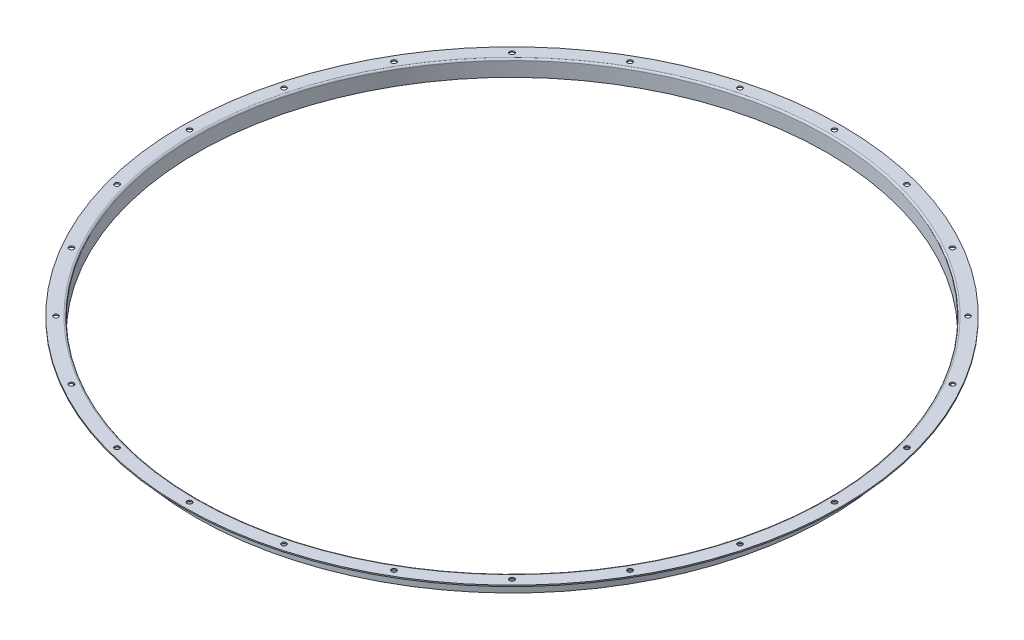
ISO-10303-21;
HEADER;
FILE_DESCRIPTION(('STEP AP214'),'2;1');
FILE_NAME('part.step','',(''),(''),'','','');
FILE_SCHEMA(('AUTOMOTIVE_DESIGN { 1 0 10303 214 1 1 1 1 }'));
ENDSEC;
DATA;
#1=APPLICATION_CONTEXT('core data for automotive mechanical design processes');
#2=APPLICATION_PROTOCOL_DEFINITION('international standard','automotive_design',2000,#1);
#3=PRODUCT_CONTEXT('',#1,'mechanical');
#4=PRODUCT('Part','Part','',(#3));
#5=PRODUCT_RELATED_PRODUCT_CATEGORY('part','',(#4));
#6=PRODUCT_DEFINITION_FORMATION('','',#4);
#7=PRODUCT_DEFINITION_CONTEXT('part definition',#1,'design');
#8=PRODUCT_DEFINITION('design','',#6,#7);
#9=PRODUCT_DEFINITION_SHAPE('','',#8);
#10=(LENGTH_UNIT() NAMED_UNIT(*) SI_UNIT(.MILLI.,.METRE.));
#11=(NAMED_UNIT(*) PLANE_ANGLE_UNIT() SI_UNIT($,.RADIAN.));
#12=(NAMED_UNIT(*) SI_UNIT($,.STERADIAN.) SOLID_ANGLE_UNIT());
#13=UNCERTAINTY_MEASURE_WITH_UNIT(LENGTH_MEASURE(1.E-05),#10,'distance_accuracy_value','');
#14=(GEOMETRIC_REPRESENTATION_CONTEXT(3) GLOBAL_UNCERTAINTY_ASSIGNED_CONTEXT((#13)) GLOBAL_UNIT_ASSIGNED_CONTEXT((#10,
#11,#12)) REPRESENTATION_CONTEXT('',''));
#15=CARTESIAN_POINT('',(0.,0.,0.));
#16=DIRECTION('',(0.,0.,1.));
#17=DIRECTION('',(1.,0.,0.));
#18=AXIS2_PLACEMENT_3D('',#15,#16,#17);
#19=CARTESIAN_POINT('',(0.,-2.5,0.));
#20=DIRECTION('',(0.,1.,0.));
#21=DIRECTION('',(0.,0.,1.));
#22=AXIS2_PLACEMENT_3D('',#19,#20,#21);
#23=PLANE('',#22);
#24=CARTESIAN_POINT('',(471.993776442016,-2.5,-471.993776442047));
#25=DIRECTION('',(0.,1.,0.));
#26=DIRECTION('',(0.,0.,1.));
#27=AXIS2_PLACEMENT_3D('',#24,#25,#26);
#28=CIRCLE('',#27,5.00000000007998);
#29=CARTESIAN_POINT('',(471.993776442016,-2.5,-466.993776441967));
#30=VERTEX_POINT('',#29);
#31=EDGE_CURVE('E139',#30,#30,#28,.T.);
#32=ORIENTED_EDGE('',*,*,#31,.T.);
#33=EDGE_LOOP('',(#32));
#34=FACE_BOUND('',#33,.T.);
#35=CARTESIAN_POINT('',(-1.5496433923496E-11,-2.5,-667.5));
#36=DIRECTION('',(0.,1.,0.));
#37=DIRECTION('',(0.,0.,1.));
#38=AXIS2_PLACEMENT_3D('',#35,#36,#37);
#39=CIRCLE('',#38,5.00000000007998);
#40=CARTESIAN_POINT('',(-1.5496433923496E-11,-2.5,-662.49999999992));
#41=VERTEX_POINT('',#40);
#42=EDGE_CURVE('E349',#41,#41,#39,.T.);
#43=ORIENTED_EDGE('',*,*,#42,.T.);
#44=EDGE_LOOP('',(#43));
#45=FACE_BOUND('',#44,.T.);
#46=CARTESIAN_POINT('',(333.749999999989,-2.5,-578.071957026132));
#47=DIRECTION('',(0.,1.,0.));
#48=DIRECTION('',(0.,0.,1.));
#49=AXIS2_PLACEMENT_3D('',#46,#47,#48);
#50=CIRCLE('',#49,5.00000000007999);
#51=CARTESIAN_POINT('',(333.749999999989,-2.5,-573.071957026052));
#52=VERTEX_POINT('',#51);
#53=EDGE_CURVE('E347',#52,#52,#50,.T.);
#54=ORIENTED_EDGE('',*,*,#53,.T.);
#55=EDGE_LOOP('',(#54));
#56=FACE_BOUND('',#55,.T.);
#57=CARTESIAN_POINT('',(172.761712605918,-2.5,-644.755489047963));
#58=DIRECTION('',(0.,1.,0.));
#59=DIRECTION('',(0.,0.,1.));
#60=AXIS2_PLACEMENT_3D('',#57,#58,#59);
#61=CIRCLE('',#60,5.00000000007999);
#62=CARTESIAN_POINT('',(172.761712605918,-2.5,-639.755489047883));
#63=VERTEX_POINT('',#62);
#64=EDGE_CURVE('E344',#63,#63,#61,.T.);
#65=ORIENTED_EDGE('',*,*,#64,.T.);
#66=EDGE_LOOP('',(#65));
#67=FACE_BOUND('',#66,.T.);
#68=CARTESIAN_POINT('',(578.071957026116,-2.5,-333.750000000033));
#69=DIRECTION('',(0.,1.,0.));
#70=DIRECTION('',(0.,0.,1.));
#71=AXIS2_PLACEMENT_3D('',#68,#69,#70);
#72=CIRCLE('',#71,5.00000000007992);
#73=CARTESIAN_POINT('',(578.071957026116,-2.5,-328.749999999953));
#74=VERTEX_POINT('',#73);
#75=EDGE_CURVE('E341',#74,#74,#72,.T.);
#76=ORIENTED_EDGE('',*,*,#75,.T.);
#77=EDGE_LOOP('',(#76));
#78=FACE_BOUND('',#77,.T.);
#79=CARTESIAN_POINT('',(644.755489047966,-2.5,-172.761712605969));
#80=DIRECTION('',(0.,1.,0.));
#81=DIRECTION('',(0.,0.,1.));
#82=AXIS2_PLACEMENT_3D('',#79,#80,#81);
#83=CIRCLE('',#82,5.00000000007992);
#84=CARTESIAN_POINT('',(644.755489047966,-2.5,-167.761712605889));
#85=VERTEX_POINT('',#84);
#86=EDGE_CURVE('E338',#85,#85,#83,.T.);
#87=ORIENTED_EDGE('',*,*,#86,.T.);
#88=EDGE_LOOP('',(#87));
#89=FACE_BOUND('',#88,.T.);
#90=CARTESIAN_POINT('',(667.500000000022,-2.5,-3.78612369157463E-11));
#91=DIRECTION('',(0.,1.,0.));
#92=DIRECTION('',(0.,0.,1.));
#93=AXIS2_PLACEMENT_3D('',#90,#91,#92);
#94=CIRCLE('',#93,5.00000000007992);
#95=CARTESIAN_POINT('',(667.500000000022,-2.5,5.00000000004206));
#96=VERTEX_POINT('',#95);
#97=EDGE_CURVE('E335',#96,#96,#94,.T.);
#98=ORIENTED_EDGE('',*,*,#97,.T.);
#99=EDGE_LOOP('',(#98));
#100=FACE_BOUND('',#99,.T.);
#101=CARTESIAN_POINT('',(644.755489047985,-2.5,172.761712605896));
#102=DIRECTION('',(0.,1.,0.));
#103=DIRECTION('',(0.,0.,1.));
#104=AXIS2_PLACEMENT_3D('',#101,#102,#103);
#105=CIRCLE('',#104,5.00000000007992);
#106=CARTESIAN_POINT('',(644.755489047985,-2.5,177.761712605976));
#107=VERTEX_POINT('',#106);
#108=EDGE_CURVE('E332',#107,#107,#105,.T.);
#109=ORIENTED_EDGE('',*,*,#108,.T.);
#110=EDGE_LOOP('',(#109));
#111=FACE_BOUND('',#110,.T.);
#112=CARTESIAN_POINT('',(578.071957026154,-2.5,333.749999999967));
#113=DIRECTION('',(0.,1.,0.));
#114=DIRECTION('',(0.,0.,1.));
#115=AXIS2_PLACEMENT_3D('',#112,#113,#114);
#116=CIRCLE('',#115,5.00000000007992);
#117=CARTESIAN_POINT('',(578.071957026154,-2.5,338.750000000047));
#118=VERTEX_POINT('',#117);
#119=EDGE_CURVE('E329',#118,#118,#116,.T.);
#120=ORIENTED_EDGE('',*,*,#119,.T.);
#121=EDGE_LOOP('',(#120));
#122=FACE_BOUND('',#121,.T.);
#123=CARTESIAN_POINT('',(471.99377644207,-2.5,471.993776441994));
#124=DIRECTION('',(0.,1.,0.));
#125=DIRECTION('',(0.,0.,1.));
#126=AXIS2_PLACEMENT_3D('',#123,#124,#125);
#127=CIRCLE('',#126,5.00000000007998);
#128=CARTESIAN_POINT('',(471.99377644207,-2.5,476.993776442074));
#129=VERTEX_POINT('',#128);
#130=EDGE_CURVE('E326',#129,#129,#127,.T.);
#131=ORIENTED_EDGE('',*,*,#130,.T.);
#132=EDGE_LOOP('',(#131));
#133=FACE_BOUND('',#132,.T.);
#134=CARTESIAN_POINT('',(333.750000000055,-2.5,578.071957026094));
#135=DIRECTION('',(0.,1.,0.));
#136=DIRECTION('',(0.,0.,1.));
#137=AXIS2_PLACEMENT_3D('',#134,#135,#136);
#138=CIRCLE('',#137,5.00000000007999);
#139=CARTESIAN_POINT('',(333.750000000055,-2.5,583.071957026174));
#140=VERTEX_POINT('',#139);
#141=EDGE_CURVE('E323',#140,#140,#138,.T.);
#142=ORIENTED_EDGE('',*,*,#141,.T.);
#143=EDGE_LOOP('',(#142));
#144=FACE_BOUND('',#143,.T.);
#145=CARTESIAN_POINT('',(172.761712605992,-2.5,644.755489047943));
#146=DIRECTION('',(0.,1.,0.));
#147=DIRECTION('',(0.,0.,1.));
#148=AXIS2_PLACEMENT_3D('',#145,#146,#147);
#149=CIRCLE('',#148,5.00000000007999);
#150=CARTESIAN_POINT('',(172.761712605992,-2.5,649.755489048023));
#151=VERTEX_POINT('',#150);
#152=EDGE_CURVE('E320',#151,#151,#149,.T.);
#153=ORIENTED_EDGE('',*,*,#152,.T.);
#154=EDGE_LOOP('',(#153));
#155=FACE_BOUND('',#154,.T.);
#156=CARTESIAN_POINT('',(6.02260399079966E-11,-2.5,667.5));
#157=DIRECTION('',(0.,1.,0.));
#158=DIRECTION('',(0.,0.,1.));
#159=AXIS2_PLACEMENT_3D('',#156,#157,#158);
#160=CIRCLE('',#159,5.00000000007998);
#161=CARTESIAN_POINT('',(6.02260399079966E-11,-2.5,672.50000000008));
#162=VERTEX_POINT('',#161);
#163=EDGE_CURVE('E317',#162,#162,#160,.T.);
#164=ORIENTED_EDGE('',*,*,#163,.T.);
#165=EDGE_LOOP('',(#164));
#166=FACE_BOUND('',#165,.T.);
#167=CARTESIAN_POINT('',(-172.761712605873,-2.5,644.755489047963));
#168=DIRECTION('',(0.,1.,0.));
#169=DIRECTION('',(0.,0.,1.));
#170=AXIS2_PLACEMENT_3D('',#167,#168,#169);
#171=CIRCLE('',#170,5.00000000007999);
#172=CARTESIAN_POINT('',(-172.761712605873,-2.5,649.755489048043));
#173=VERTEX_POINT('',#172);
#174=EDGE_CURVE('E314',#173,#173,#171,.T.);
#175=ORIENTED_EDGE('',*,*,#174,.T.);
#176=EDGE_LOOP('',(#175));
#177=FACE_BOUND('',#176,.T.);
#178=CARTESIAN_POINT('',(-333.749999999945,-2.5,578.071957026132));
#179=DIRECTION('',(0.,1.,0.));
#180=DIRECTION('',(0.,0.,1.));
#181=AXIS2_PLACEMENT_3D('',#178,#179,#180);
#182=CIRCLE('',#181,5.00000000007999);
#183=CARTESIAN_POINT('',(-333.749999999945,-2.5,583.071957026212));
#184=VERTEX_POINT('',#183);
#185=EDGE_CURVE('E311',#184,#184,#182,.T.);
#186=ORIENTED_EDGE('',*,*,#185,.T.);
#187=EDGE_LOOP('',(#186));
#188=FACE_BOUND('',#187,.T.);
#189=CARTESIAN_POINT('',(-471.993776441971,-2.5,471.993776442047));
#190=DIRECTION('',(0.,1.,0.));
#191=DIRECTION('',(0.,0.,1.));
#192=AXIS2_PLACEMENT_3D('',#189,#190,#191);
#193=CIRCLE('',#192,5.00000000007998);
#194=CARTESIAN_POINT('',(-471.993776441971,-2.5,476.993776442127));
#195=VERTEX_POINT('',#194);
#196=EDGE_CURVE('E308',#195,#195,#193,.T.);
#197=ORIENTED_EDGE('',*,*,#196,.T.);
#198=EDGE_LOOP('',(#197));
#199=FACE_BOUND('',#198,.T.);
#200=CARTESIAN_POINT('',(-172.761712605947,-2.5,-644.755489047943));
#201=DIRECTION('',(0.,1.,0.));
#202=DIRECTION('',(0.,0.,1.));
#203=AXIS2_PLACEMENT_3D('',#200,#201,#202);
#204=CIRCLE('',#203,5.00000000007999);
#205=CARTESIAN_POINT('',(-172.761712605947,-2.5,-639.755489047863));
#206=VERTEX_POINT('',#205);
#207=EDGE_CURVE('E299',#206,#206,#204,.T.);
#208=ORIENTED_EDGE('',*,*,#207,.T.);
#209=EDGE_LOOP('',(#208));
#210=FACE_BOUND('',#209,.T.);
#211=CARTESIAN_POINT('',(-578.07195702611,-2.5,-333.749999999967));
#212=DIRECTION('',(0.,1.,0.));
#213=DIRECTION('',(0.,0.,1.));
#214=AXIS2_PLACEMENT_3D('',#211,#212,#213);
#215=CIRCLE('',#214,5.00000000008166);
#216=CARTESIAN_POINT('',(-578.07195702611,-2.5,-328.749999999885));
#217=VERTEX_POINT('',#216);
#218=EDGE_CURVE('E295',#217,#217,#215,.T.);
#219=ORIENTED_EDGE('',*,*,#218,.T.);
#220=EDGE_LOOP('',(#219));
#221=FACE_BOUND('',#220,.T.);
#222=CARTESIAN_POINT('',(-471.993776442025,-2.5,-471.993776441994));
#223=DIRECTION('',(0.,1.,0.));
#224=DIRECTION('',(0.,0.,1.));
#225=AXIS2_PLACEMENT_3D('',#222,#223,#224);
#226=CIRCLE('',#225,5.00000000008247);
#227=CARTESIAN_POINT('',(-471.993776442025,-2.5,-466.993776441911));
#228=VERTEX_POINT('',#227);
#229=EDGE_CURVE('E293',#228,#228,#226,.T.);
#230=ORIENTED_EDGE('',*,*,#229,.T.);
#231=EDGE_LOOP('',(#230));
#232=FACE_BOUND('',#231,.T.);
#233=CARTESIAN_POINT('',(-333.750000000011,-2.5,-578.071957026094));
#234=DIRECTION('',(0.,1.,0.));
#235=DIRECTION('',(0.,0.,1.));
#236=AXIS2_PLACEMENT_3D('',#233,#234,#235);
#237=CIRCLE('',#236,5.00000000008293);
#238=CARTESIAN_POINT('',(-333.750000000011,-2.5,-573.071957026011));
#239=VERTEX_POINT('',#238);
#240=EDGE_CURVE('E296',#239,#239,#237,.T.);
#241=ORIENTED_EDGE('',*,*,#240,.T.);
#242=EDGE_LOOP('',(#241));
#243=FACE_BOUND('',#242,.T.);
#244=CARTESIAN_POINT('',(-644.755489047941,-2.5,-172.761712605896));
#245=DIRECTION('',(0.,1.,0.));
#246=DIRECTION('',(0.,0.,1.));
#247=AXIS2_PLACEMENT_3D('',#244,#245,#246);
#248=CIRCLE('',#247,5.00000000007981);
#249=CARTESIAN_POINT('',(-644.755489047941,-2.5,-167.761712605816));
#250=VERTEX_POINT('',#249);
#251=EDGE_CURVE('E302',#250,#250,#248,.T.);
#252=ORIENTED_EDGE('',*,*,#251,.T.);
#253=EDGE_LOOP('',(#252));
#254=FACE_BOUND('',#253,.T.);
#255=CARTESIAN_POINT('',(-667.499999999978,-2.5,3.79429820895893E-11));
#256=DIRECTION('',(0.,1.,0.));
#257=DIRECTION('',(0.,0.,1.));
#258=AXIS2_PLACEMENT_3D('',#255,#256,#257);
#259=CIRCLE('',#258,5.00000000007992);
#260=CARTESIAN_POINT('',(-667.499999999978,-2.5,5.00000000011787));
#261=VERTEX_POINT('',#260);
#262=EDGE_CURVE('E396',#261,#261,#259,.T.);
#263=ORIENTED_EDGE('',*,*,#262,.T.);
#264=EDGE_LOOP('',(#263));
#265=FACE_BOUND('',#264,.T.);
#266=CARTESIAN_POINT('',(-644.755489047921,-2.5,172.76171260597));
#267=DIRECTION('',(0.,1.,0.));
#268=DIRECTION('',(0.,0.,1.));
#269=AXIS2_PLACEMENT_3D('',#266,#267,#268);
#270=CIRCLE('',#269,5.00000000007992);
#271=CARTESIAN_POINT('',(-644.755489047921,-2.5,177.76171260605));
#272=VERTEX_POINT('',#271);
#273=EDGE_CURVE('E400',#272,#272,#270,.T.);
#274=ORIENTED_EDGE('',*,*,#273,.T.);
#275=EDGE_LOOP('',(#274));
#276=FACE_BOUND('',#275,.T.);
#277=CARTESIAN_POINT('',(-578.071957026071,-2.5,333.750000000033));
#278=DIRECTION('',(0.,1.,0.));
#279=DIRECTION('',(0.,0.,1.));
#280=AXIS2_PLACEMENT_3D('',#277,#278,#279);
#281=CIRCLE('',#280,5.00000000007992);
#282=CARTESIAN_POINT('',(-578.071957026071,-2.5,338.750000000113));
#283=VERTEX_POINT('',#282);
#284=EDGE_CURVE('E404',#283,#283,#281,.T.);
#285=ORIENTED_EDGE('',*,*,#284,.T.);
#286=EDGE_LOOP('',(#285));
#287=FACE_BOUND('',#286,.T.);
#288=CARTESIAN_POINT('',(0.,-2.5,0.));
#289=DIRECTION('',(0.,1.,0.));
#290=DIRECTION('',(0.,0.,1.));
#291=AXIS2_PLACEMENT_3D('',#288,#289,#290);
#292=CIRCLE('',#291,682.5);
#293=CARTESIAN_POINT('',(0.,-2.5,682.5));
#294=VERTEX_POINT('',#293);
#295=EDGE_CURVE('E96',#294,#294,#292,.T.);
#296=ORIENTED_EDGE('',*,*,#295,.F.);
#297=EDGE_LOOP('',(#296));
#298=FACE_BOUND('',#297,.T.);
#299=CARTESIAN_POINT('',(0.,-2.5,0.));
#300=DIRECTION('',(0.,1.,0.));
#301=DIRECTION('',(0.,0.,1.));
#302=AXIS2_PLACEMENT_3D('',#299,#300,#301);
#303=CIRCLE('',#302,656.);
#304=CARTESIAN_POINT('',(0.,-2.5,656.));
#305=VERTEX_POINT('',#304);
#306=EDGE_CURVE('E12',#305,#305,#303,.F.);
#307=ORIENTED_EDGE('',*,*,#306,.F.);
#308=EDGE_LOOP('',(#307));
#309=FACE_BOUND('',#308,.T.);
#310=ADVANCED_FACE('F88',(#34,#45,#56,#67,#78,#89,#100,#111,#122,#133,#144,#155,#166,#177,#188,
#199,#210,#221,#232,#243,#254,#265,#276,#287,#298,#309),#23,.F.);
#311=CARTESIAN_POINT('',(0.,0.,0.));
#312=DIRECTION('',(0.,1.,0.));
#313=DIRECTION('',(0.,0.,1.));
#314=AXIS2_PLACEMENT_3D('',#311,#312,#313);
#315=PLANE('',#314);
#316=CARTESIAN_POINT('',(471.993776442016,0.,-471.993776442047));
#317=DIRECTION('',(0.,1.,0.));
#318=DIRECTION('',(0.,0.,1.));
#319=AXIS2_PLACEMENT_3D('',#316,#317,#318);
#320=CIRCLE('',#319,5.00000000007998);
#321=CARTESIAN_POINT('',(471.993776442016,0.,-466.993776441967));
#322=VERTEX_POINT('',#321);
#323=EDGE_CURVE('E452',#322,#322,#320,.T.);
#324=ORIENTED_EDGE('',*,*,#323,.F.);
#325=EDGE_LOOP('',(#324));
#326=FACE_BOUND('',#325,.T.);
#327=CARTESIAN_POINT('',(-1.5496433923496E-11,0.,-667.5));
#328=DIRECTION('',(0.,1.,0.));
#329=DIRECTION('',(0.,0.,1.));
#330=AXIS2_PLACEMENT_3D('',#327,#328,#329);
#331=CIRCLE('',#330,5.00000000007998);
#332=CARTESIAN_POINT('',(-1.5496433923496E-11,0.,-662.49999999992));
#333=VERTEX_POINT('',#332);
#334=EDGE_CURVE('E456',#333,#333,#331,.T.);
#335=ORIENTED_EDGE('',*,*,#334,.F.);
#336=EDGE_LOOP('',(#335));
#337=FACE_BOUND('',#336,.T.);
#338=CARTESIAN_POINT('',(333.749999999989,0.,-578.071957026132));
#339=DIRECTION('',(0.,1.,0.));
#340=DIRECTION('',(0.,0.,1.));
#341=AXIS2_PLACEMENT_3D('',#338,#339,#340);
#342=CIRCLE('',#341,5.00000000007999);
#343=CARTESIAN_POINT('',(333.749999999989,0.,-573.071957026052));
#344=VERTEX_POINT('',#343);
#345=EDGE_CURVE('E453',#344,#344,#342,.T.);
#346=ORIENTED_EDGE('',*,*,#345,.F.);
#347=EDGE_LOOP('',(#346));
#348=FACE_BOUND('',#347,.T.);
#349=CARTESIAN_POINT('',(172.761712605918,0.,-644.755489047963));
#350=DIRECTION('',(0.,1.,0.));
#351=DIRECTION('',(0.,0.,1.));
#352=AXIS2_PLACEMENT_3D('',#349,#350,#351);
#353=CIRCLE('',#352,5.00000000007999);
#354=CARTESIAN_POINT('',(172.761712605918,0.,-639.755489047883));
#355=VERTEX_POINT('',#354);
#356=EDGE_CURVE('E411',#355,#355,#353,.T.);
#357=ORIENTED_EDGE('',*,*,#356,.F.);
#358=EDGE_LOOP('',(#357));
#359=FACE_BOUND('',#358,.T.);
#360=CARTESIAN_POINT('',(578.071957026116,0.,-333.750000000033));
#361=DIRECTION('',(0.,1.,0.));
#362=DIRECTION('',(0.,0.,1.));
#363=AXIS2_PLACEMENT_3D('',#360,#361,#362);
#364=CIRCLE('',#363,5.00000000007992);
#365=CARTESIAN_POINT('',(578.071957026116,0.,-328.749999999953));
#366=VERTEX_POINT('',#365);
#367=EDGE_CURVE('E449',#366,#366,#364,.T.);
#368=ORIENTED_EDGE('',*,*,#367,.F.);
#369=EDGE_LOOP('',(#368));
#370=FACE_BOUND('',#369,.T.);
#371=CARTESIAN_POINT('',(644.755489047966,0.,-172.761712605969));
#372=DIRECTION('',(0.,1.,0.));
#373=DIRECTION('',(0.,0.,1.));
#374=AXIS2_PLACEMENT_3D('',#371,#372,#373);
#375=CIRCLE('',#374,5.00000000007992);
#376=CARTESIAN_POINT('',(644.755489047966,0.,-167.761712605889));
#377=VERTEX_POINT('',#376);
#378=EDGE_CURVE('E446',#377,#377,#375,.T.);
#379=ORIENTED_EDGE('',*,*,#378,.F.);
#380=EDGE_LOOP('',(#379));
#381=FACE_BOUND('',#380,.T.);
#382=CARTESIAN_POINT('',(667.500000000022,0.,-3.78612369157463E-11));
#383=DIRECTION('',(0.,1.,0.));
#384=DIRECTION('',(0.,0.,1.));
#385=AXIS2_PLACEMENT_3D('',#382,#383,#384);
#386=CIRCLE('',#385,5.00000000007992);
#387=CARTESIAN_POINT('',(667.500000000022,0.,5.00000000004206));
#388=VERTEX_POINT('',#387);
#389=EDGE_CURVE('E443',#388,#388,#386,.T.);
#390=ORIENTED_EDGE('',*,*,#389,.F.);
#391=EDGE_LOOP('',(#390));
#392=FACE_BOUND('',#391,.T.);
#393=CARTESIAN_POINT('',(644.755489047985,0.,172.761712605896));
#394=DIRECTION('',(0.,1.,0.));
#395=DIRECTION('',(0.,0.,1.));
#396=AXIS2_PLACEMENT_3D('',#393,#394,#395);
#397=CIRCLE('',#396,5.00000000007992);
#398=CARTESIAN_POINT('',(644.755489047985,0.,177.761712605976));
#399=VERTEX_POINT('',#398);
#400=EDGE_CURVE('E440',#399,#399,#397,.T.);
#401=ORIENTED_EDGE('',*,*,#400,.F.);
#402=EDGE_LOOP('',(#401));
#403=FACE_BOUND('',#402,.T.);
#404=CARTESIAN_POINT('',(578.071957026154,0.,333.749999999967));
#405=DIRECTION('',(0.,1.,0.));
#406=DIRECTION('',(0.,0.,1.));
#407=AXIS2_PLACEMENT_3D('',#404,#405,#406);
#408=CIRCLE('',#407,5.00000000007992);
#409=CARTESIAN_POINT('',(578.071957026154,0.,338.750000000047));
#410=VERTEX_POINT('',#409);
#411=EDGE_CURVE('E437',#410,#410,#408,.T.);
#412=ORIENTED_EDGE('',*,*,#411,.F.);
#413=EDGE_LOOP('',(#412));
#414=FACE_BOUND('',#413,.T.);
#415=CARTESIAN_POINT('',(471.99377644207,0.,471.993776441994));
#416=DIRECTION('',(0.,1.,0.));
#417=DIRECTION('',(0.,0.,1.));
#418=AXIS2_PLACEMENT_3D('',#415,#416,#417);
#419=CIRCLE('',#418,5.00000000007998);
#420=CARTESIAN_POINT('',(471.99377644207,0.,476.993776442074));
#421=VERTEX_POINT('',#420);
#422=EDGE_CURVE('E434',#421,#421,#419,.T.);
#423=ORIENTED_EDGE('',*,*,#422,.F.);
#424=EDGE_LOOP('',(#423));
#425=FACE_BOUND('',#424,.T.);
#426=CARTESIAN_POINT('',(333.750000000055,0.,578.071957026094));
#427=DIRECTION('',(0.,1.,0.));
#428=DIRECTION('',(0.,0.,1.));
#429=AXIS2_PLACEMENT_3D('',#426,#427,#428);
#430=CIRCLE('',#429,5.00000000007999);
#431=CARTESIAN_POINT('',(333.750000000055,0.,583.071957026174));
#432=VERTEX_POINT('',#431);
#433=EDGE_CURVE('E431',#432,#432,#430,.T.);
#434=ORIENTED_EDGE('',*,*,#433,.F.);
#435=EDGE_LOOP('',(#434));
#436=FACE_BOUND('',#435,.T.);
#437=CARTESIAN_POINT('',(172.761712605992,0.,644.755489047943));
#438=DIRECTION('',(0.,1.,0.));
#439=DIRECTION('',(0.,0.,1.));
#440=AXIS2_PLACEMENT_3D('',#437,#438,#439);
#441=CIRCLE('',#440,5.00000000007999);
#442=CARTESIAN_POINT('',(172.761712605992,0.,649.755489048023));
#443=VERTEX_POINT('',#442);
#444=EDGE_CURVE('E428',#443,#443,#441,.T.);
#445=ORIENTED_EDGE('',*,*,#444,.F.);
#446=EDGE_LOOP('',(#445));
#447=FACE_BOUND('',#446,.T.);
#448=CARTESIAN_POINT('',(6.02260399079966E-11,0.,667.5));
#449=DIRECTION('',(0.,1.,0.));
#450=DIRECTION('',(0.,0.,1.));
#451=AXIS2_PLACEMENT_3D('',#448,#449,#450);
#452=CIRCLE('',#451,5.00000000007998);
#453=CARTESIAN_POINT('',(6.02260399079966E-11,0.,672.50000000008));
#454=VERTEX_POINT('',#453);
#455=EDGE_CURVE('E425',#454,#454,#452,.T.);
#456=ORIENTED_EDGE('',*,*,#455,.F.);
#457=EDGE_LOOP('',(#456));
#458=FACE_BOUND('',#457,.T.);
#459=CARTESIAN_POINT('',(-172.761712605873,0.,644.755489047963));
#460=DIRECTION('',(0.,1.,0.));
#461=DIRECTION('',(0.,0.,1.));
#462=AXIS2_PLACEMENT_3D('',#459,#460,#461);
#463=CIRCLE('',#462,5.00000000007999);
#464=CARTESIAN_POINT('',(-172.761712605873,0.,649.755489048043));
#465=VERTEX_POINT('',#464);
#466=EDGE_CURVE('E422',#465,#465,#463,.T.);
#467=ORIENTED_EDGE('',*,*,#466,.F.);
#468=EDGE_LOOP('',(#467));
#469=FACE_BOUND('',#468,.T.);
#470=CARTESIAN_POINT('',(-333.749999999945,0.,578.071957026132));
#471=DIRECTION('',(0.,1.,0.));
#472=DIRECTION('',(0.,0.,1.));
#473=AXIS2_PLACEMENT_3D('',#470,#471,#472);
#474=CIRCLE('',#473,5.00000000007999);
#475=CARTESIAN_POINT('',(-333.749999999945,0.,583.071957026212));
#476=VERTEX_POINT('',#475);
#477=EDGE_CURVE('E418',#476,#476,#474,.T.);
#478=ORIENTED_EDGE('',*,*,#477,.F.);
#479=EDGE_LOOP('',(#478));
#480=FACE_BOUND('',#479,.T.);
#481=CARTESIAN_POINT('',(-471.993776441971,0.,471.993776442047));
#482=DIRECTION('',(0.,1.,0.));
#483=DIRECTION('',(0.,0.,1.));
#484=AXIS2_PLACEMENT_3D('',#481,#482,#483);
#485=CIRCLE('',#484,5.00000000007998);
#486=CARTESIAN_POINT('',(-471.993776441971,0.,476.993776442127));
#487=VERTEX_POINT('',#486);
#488=EDGE_CURVE('E415',#487,#487,#485,.T.);
#489=ORIENTED_EDGE('',*,*,#488,.F.);
#490=EDGE_LOOP('',(#489));
#491=FACE_BOUND('',#490,.T.);
#492=CARTESIAN_POINT('',(-172.761712605947,0.,-644.755489047943));
#493=DIRECTION('',(0.,1.,0.));
#494=DIRECTION('',(0.,0.,1.));
#495=AXIS2_PLACEMENT_3D('',#492,#493,#494);
#496=CIRCLE('',#495,5.00000000007999);
#497=CARTESIAN_POINT('',(-172.761712605947,0.,-639.755489047863));
#498=VERTEX_POINT('',#497);
#499=EDGE_CURVE('E467',#498,#498,#496,.T.);
#500=ORIENTED_EDGE('',*,*,#499,.F.);
#501=EDGE_LOOP('',(#500));
#502=FACE_BOUND('',#501,.T.);
#503=CARTESIAN_POINT('',(-578.07195702611,0.,-333.749999999967));
#504=DIRECTION('',(0.,1.,0.));
#505=DIRECTION('',(0.,0.,1.));
#506=AXIS2_PLACEMENT_3D('',#503,#504,#505);
#507=CIRCLE('',#506,5.00000000008166);
#508=CARTESIAN_POINT('',(-578.07195702611,0.,-328.749999999885));
#509=VERTEX_POINT('',#508);
#510=EDGE_CURVE('E475',#509,#509,#507,.T.);
#511=ORIENTED_EDGE('',*,*,#510,.F.);
#512=EDGE_LOOP('',(#511));
#513=FACE_BOUND('',#512,.T.);
#514=CARTESIAN_POINT('',(-471.993776442025,0.,-471.993776441994));
#515=DIRECTION('',(0.,1.,0.));
#516=DIRECTION('',(0.,0.,1.));
#517=AXIS2_PLACEMENT_3D('',#514,#515,#516);
#518=CIRCLE('',#517,5.00000000008247);
#519=CARTESIAN_POINT('',(-471.993776442025,0.,-466.993776441911));
#520=VERTEX_POINT('',#519);
#521=EDGE_CURVE('E290',#520,#520,#518,.T.);
#522=ORIENTED_EDGE('',*,*,#521,.F.);
#523=EDGE_LOOP('',(#522));
#524=FACE_BOUND('',#523,.T.);
#525=CARTESIAN_POINT('',(-333.750000000011,0.,-578.071957026094));
#526=DIRECTION('',(0.,1.,0.));
#527=DIRECTION('',(0.,0.,1.));
#528=AXIS2_PLACEMENT_3D('',#525,#526,#527);
#529=CIRCLE('',#528,5.00000000008293);
#530=CARTESIAN_POINT('',(-333.750000000011,0.,-573.071957026011));
#531=VERTEX_POINT('',#530);
#532=EDGE_CURVE('E463',#531,#531,#529,.T.);
#533=ORIENTED_EDGE('',*,*,#532,.F.);
#534=EDGE_LOOP('',(#533));
#535=FACE_BOUND('',#534,.T.);
#536=CARTESIAN_POINT('',(-644.755489047941,0.,-172.761712605896));
#537=DIRECTION('',(0.,1.,0.));
#538=DIRECTION('',(0.,0.,1.));
#539=AXIS2_PLACEMENT_3D('',#536,#537,#538);
#540=CIRCLE('',#539,5.00000000007981);
#541=CARTESIAN_POINT('',(-644.755489047941,0.,-167.761712605816));
#542=VERTEX_POINT('',#541);
#543=EDGE_CURVE('E466',#542,#542,#540,.T.);
#544=ORIENTED_EDGE('',*,*,#543,.F.);
#545=EDGE_LOOP('',(#544));
#546=FACE_BOUND('',#545,.T.);
#547=CARTESIAN_POINT('',(-667.499999999978,0.,3.79429820895893E-11));
#548=DIRECTION('',(0.,1.,0.));
#549=DIRECTION('',(0.,0.,1.));
#550=AXIS2_PLACEMENT_3D('',#547,#548,#549);
#551=CIRCLE('',#550,5.00000000007992);
#552=CARTESIAN_POINT('',(-667.499999999978,0.,5.00000000011787));
#553=VERTEX_POINT('',#552);
#554=EDGE_CURVE('E470',#553,#553,#551,.T.);
#555=ORIENTED_EDGE('',*,*,#554,.F.);
#556=EDGE_LOOP('',(#555));
#557=FACE_BOUND('',#556,.T.);
#558=CARTESIAN_POINT('',(-644.755489047921,0.,172.76171260597));
#559=DIRECTION('',(0.,1.,0.));
#560=DIRECTION('',(0.,0.,1.));
#561=AXIS2_PLACEMENT_3D('',#558,#559,#560);
#562=CIRCLE('',#561,5.00000000007992);
#563=CARTESIAN_POINT('',(-644.755489047921,0.,177.76171260605));
#564=VERTEX_POINT('',#563);
#565=EDGE_CURVE('E419',#564,#564,#562,.T.);
#566=ORIENTED_EDGE('',*,*,#565,.F.);
#567=EDGE_LOOP('',(#566));
#568=FACE_BOUND('',#567,.T.);
#569=CARTESIAN_POINT('',(-578.071957026071,0.,333.750000000033));
#570=DIRECTION('',(0.,1.,0.));
#571=DIRECTION('',(0.,0.,1.));
#572=AXIS2_PLACEMENT_3D('',#569,#570,#571);
#573=CIRCLE('',#572,5.00000000007992);
#574=CARTESIAN_POINT('',(-578.071957026071,0.,338.750000000113));
#575=VERTEX_POINT('',#574);
#576=EDGE_CURVE('E407',#575,#575,#573,.T.);
#577=ORIENTED_EDGE('',*,*,#576,.F.);
#578=EDGE_LOOP('',(#577));
#579=FACE_BOUND('',#578,.T.);
#580=CARTESIAN_POINT('',(0.,0.,0.));
#581=DIRECTION('',(0.,1.,0.));
#582=DIRECTION('',(0.,0.,1.));
#583=AXIS2_PLACEMENT_3D('',#580,#581,#582);
#584=CIRCLE('',#583,682.5);
#585=CARTESIAN_POINT('',(0.,0.,682.5));
#586=VERTEX_POINT('',#585);
#587=EDGE_CURVE('E152',#586,#586,#584,.T.);
#588=ORIENTED_EDGE('',*,*,#587,.T.);
#589=EDGE_LOOP('',(#588));
#590=FACE_BOUND('',#589,.T.);
#591=CARTESIAN_POINT('',(0.,0.,0.));
#592=DIRECTION('',(0.,1.,0.));
#593=DIRECTION('',(0.,0.,1.));
#594=AXIS2_PLACEMENT_3D('',#591,#592,#593);
#595=CIRCLE('',#594,656.);
#596=CARTESIAN_POINT('',(0.,0.,656.));
#597=VERTEX_POINT('',#596);
#598=EDGE_CURVE('E103',#597,#597,#595,.T.);
#599=ORIENTED_EDGE('',*,*,#598,.F.);
#600=EDGE_LOOP('',(#599));
#601=FACE_BOUND('',#600,.T.);
#602=ADVANCED_FACE('F157',(#326,#337,#348,#359,#370,#381,#392,#403,#414,#425,#436,#447,#458,
#469,#480,#491,#502,#513,#524,#535,#546,#557,#568,#579,#590,#601),#315,.T.);
#603=CARTESIAN_POINT('',(0.,-2.5,0.));
#604=DIRECTION('',(0.,1.,0.));
#605=DIRECTION('',(0.,0.,1.));
#606=AXIS2_PLACEMENT_3D('',#603,#604,#605);
#607=CYLINDRICAL_SURFACE('',#606,682.5);
#608=ORIENTED_EDGE('',*,*,#295,.T.);
#609=EDGE_LOOP('',(#608));
#610=FACE_BOUND('',#609,.T.);
#611=ORIENTED_EDGE('',*,*,#587,.F.);
#612=EDGE_LOOP('',(#611));
#613=FACE_BOUND('',#612,.T.);
#614=ADVANCED_FACE('F90',(#610,#613),#607,.T.);
#615=CARTESIAN_POINT('',(0.,-33.4999999999996,0.));
#616=DIRECTION('',(0.,-1.,0.));
#617=DIRECTION('',(0.,0.,-1.));
#618=AXIS2_PLACEMENT_3D('',#615,#616,#617);
#619=PLANE('',#618);
#620=CARTESIAN_POINT('',(0.,-33.4999999999996,0.));
#621=DIRECTION('',(0.,1.,0.));
#622=DIRECTION('',(0.,0.,1.));
#623=AXIS2_PLACEMENT_3D('',#620,#621,#622);
#624=CIRCLE('',#623,652.5);
#625=CARTESIAN_POINT('',(0.,-33.4999999999996,652.5));
#626=VERTEX_POINT('',#625);
#627=EDGE_CURVE('E131',#626,#626,#624,.T.);
#628=ORIENTED_EDGE('',*,*,#627,.T.);
#629=EDGE_LOOP('',(#628));
#630=FACE_BOUND('',#629,.T.);
#631=CARTESIAN_POINT('',(0.,-33.4999999999996,0.));
#632=DIRECTION('',(0.,1.,0.));
#633=DIRECTION('',(0.,0.,1.));
#634=AXIS2_PLACEMENT_3D('',#631,#632,#633);
#635=CIRCLE('',#634,655.);
#636=CARTESIAN_POINT('',(0.,-33.4999999999996,655.));
#637=VERTEX_POINT('',#636);
#638=EDGE_CURVE('E141',#637,#637,#635,.T.);
#639=ORIENTED_EDGE('',*,*,#638,.F.);
#640=EDGE_LOOP('',(#639));
#641=FACE_BOUND('',#640,.T.);
#642=ADVANCED_FACE('F161',(#630,#641),#619,.T.);
#643=CARTESIAN_POINT('',(0.,-2.5,0.));
#644=DIRECTION('',(0.,1.,0.));
#645=DIRECTION('',(0.,0.,1.));
#646=AXIS2_PLACEMENT_3D('',#643,#644,#645);
#647=CYLINDRICAL_SURFACE('',#646,655.);
#648=DIRECTION('',(0.,-1.,0.));
#649=VECTOR('',#648,1.);
#650=CARTESIAN_POINT('',(0.,-2.5,655.));
#651=LINE('',#650,#649);
#652=CARTESIAN_POINT('',(0.,-3.5,655.));
#653=VERTEX_POINT('',#652);
#654=EDGE_CURVE('E130',#653,#637,#651,.T.);
#655=ORIENTED_EDGE('',*,*,#654,.F.);
#656=CARTESIAN_POINT('',(0.,-3.5,0.));
#657=DIRECTION('',(0.,1.,0.));
#658=DIRECTION('',(0.,0.,1.));
#659=AXIS2_PLACEMENT_3D('',#656,#657,#658);
#660=CIRCLE('',#659,655.);
#661=EDGE_CURVE('E129',#653,#653,#660,.T.);
#662=ORIENTED_EDGE('',*,*,#661,.F.);
#663=ORIENTED_EDGE('',*,*,#654,.T.);
#664=ORIENTED_EDGE('',*,*,#638,.T.);
#665=EDGE_LOOP('',(#655,#662,#663,#664));
#666=FACE_BOUND('',#665,.T.);
#667=ADVANCED_FACE('F167',(#666),#647,.T.);
#668=CARTESIAN_POINT('',(0.,-3.5,0.));
#669=DIRECTION('',(0.,1.,0.));
#670=DIRECTION('',(0.,0.,1.));
#671=AXIS2_PLACEMENT_3D('',#668,#669,#670);
#672=TOROIDAL_SURFACE('',#671,656.,1.);
#673=CARTESIAN_POINT('',(0.,-3.5,656.));
#674=DIRECTION('',(1.,0.,0.));
#675=DIRECTION('',(0.,1.,0.));
#676=AXIS2_PLACEMENT_3D('',#673,#674,#675);
#677=CIRCLE('',#676,1.);
#678=EDGE_CURVE('E127',#305,#653,#677,.F.);
#679=ORIENTED_EDGE('',*,*,#678,.F.);
#680=ORIENTED_EDGE('',*,*,#306,.T.);
#681=ORIENTED_EDGE('',*,*,#678,.T.);
#682=ORIENTED_EDGE('',*,*,#661,.T.);
#683=EDGE_LOOP('',(#679,#680,#681,#682));
#684=FACE_BOUND('',#683,.T.);
#685=ADVANCED_FACE('F126',(#684),#672,.F.);
#686=CARTESIAN_POINT('',(0.,-2.5,0.));
#687=DIRECTION('',(0.,1.,0.));
#688=DIRECTION('',(0.,0.,1.));
#689=AXIS2_PLACEMENT_3D('',#686,#687,#688);
#690=CYLINDRICAL_SURFACE('',#689,652.5);
#691=DIRECTION('',(0.,1.,0.));
#692=VECTOR('',#691,1.);
#693=CARTESIAN_POINT('',(0.,-2.5,652.5));
#694=LINE('',#693,#692);
#695=CARTESIAN_POINT('',(0.,-3.50000000000001,652.5));
#696=VERTEX_POINT('',#695);
#697=EDGE_CURVE('E144',#696,#626,#694,.F.);
#698=ORIENTED_EDGE('',*,*,#697,.T.);
#699=ORIENTED_EDGE('',*,*,#627,.F.);
#700=ORIENTED_EDGE('',*,*,#697,.F.);
#701=CARTESIAN_POINT('',(0.,-3.50000000000001,0.));
#702=DIRECTION('',(0.,1.,0.));
#703=DIRECTION('',(0.,0.,1.));
#704=AXIS2_PLACEMENT_3D('',#701,#702,#703);
#705=CIRCLE('',#704,652.5);
#706=EDGE_CURVE('E135',#696,#696,#705,.T.);
#707=ORIENTED_EDGE('',*,*,#706,.T.);
#708=EDGE_LOOP('',(#698,#699,#700,#707));
#709=FACE_BOUND('',#708,.T.);
#710=ADVANCED_FACE('F182',(#709),#690,.F.);
#711=CARTESIAN_POINT('',(0.,-3.5,0.));
#712=DIRECTION('',(0.,1.,0.));
#713=DIRECTION('',(0.,0.,1.));
#714=AXIS2_PLACEMENT_3D('',#711,#712,#713);
#715=TOROIDAL_SURFACE('',#714,656.,3.5);
#716=CARTESIAN_POINT('',(0.,-3.5,656.));
#717=DIRECTION('',(-1.,0.,0.));
#718=DIRECTION('',(0.,0.,1.));
#719=AXIS2_PLACEMENT_3D('',#716,#717,#718);
#720=CIRCLE('',#719,3.5);
#721=EDGE_CURVE('E146',#597,#696,#720,.T.);
#722=ORIENTED_EDGE('',*,*,#721,.T.);
#723=ORIENTED_EDGE('',*,*,#706,.F.);
#724=ORIENTED_EDGE('',*,*,#721,.F.);
#725=ORIENTED_EDGE('',*,*,#598,.T.);
#726=EDGE_LOOP('',(#722,#723,#724,#725));
#727=FACE_BOUND('',#726,.T.);
#728=ADVANCED_FACE('F178',(#727),#715,.T.);
#729=CARTESIAN_POINT('',(-578.071957026071,-10.,333.750000000033));
#730=DIRECTION('',(0.,1.,0.));
#731=DIRECTION('',(0.,0.,1.));
#732=AXIS2_PLACEMENT_3D('',#729,#730,#731);
#733=CYLINDRICAL_SURFACE('',#732,5.00000000007992);
#734=ORIENTED_EDGE('',*,*,#576,.T.);
#735=EDGE_LOOP('',(#734));
#736=FACE_BOUND('',#735,.T.);
#737=ORIENTED_EDGE('',*,*,#284,.F.);
#738=EDGE_LOOP('',(#737));
#739=FACE_BOUND('',#738,.T.);
#740=ADVANCED_FACE('F181',(#736,#739),#733,.F.);
#741=CARTESIAN_POINT('',(-644.755489047921,-10.,172.76171260597));
#742=DIRECTION('',(0.,1.,0.));
#743=DIRECTION('',(0.,0.,1.));
#744=AXIS2_PLACEMENT_3D('',#741,#742,#743);
#745=CYLINDRICAL_SURFACE('',#744,5.00000000007992);
#746=ORIENTED_EDGE('',*,*,#565,.T.);
#747=EDGE_LOOP('',(#746));
#748=FACE_BOUND('',#747,.T.);
#749=ORIENTED_EDGE('',*,*,#273,.F.);
#750=EDGE_LOOP('',(#749));
#751=FACE_BOUND('',#750,.T.);
#752=ADVANCED_FACE('F193',(#748,#751),#745,.F.);
#753=CARTESIAN_POINT('',(-667.499999999978,-10.,3.79429820895893E-11));
#754=DIRECTION('',(0.,1.,0.));
#755=DIRECTION('',(0.,0.,1.));
#756=AXIS2_PLACEMENT_3D('',#753,#754,#755);
#757=CYLINDRICAL_SURFACE('',#756,5.00000000007992);
#758=ORIENTED_EDGE('',*,*,#554,.T.);
#759=EDGE_LOOP('',(#758));
#760=FACE_BOUND('',#759,.T.);
#761=ORIENTED_EDGE('',*,*,#262,.F.);
#762=EDGE_LOOP('',(#761));
#763=FACE_BOUND('',#762,.T.);
#764=ADVANCED_FACE('F268',(#760,#763),#757,.F.);
#765=CARTESIAN_POINT('',(-644.755489047941,-10.,-172.761712605896));
#766=DIRECTION('',(0.,1.,0.));
#767=DIRECTION('',(0.,0.,1.));
#768=AXIS2_PLACEMENT_3D('',#765,#766,#767);
#769=CYLINDRICAL_SURFACE('',#768,5.00000000007981);
#770=ORIENTED_EDGE('',*,*,#543,.T.);
#771=EDGE_LOOP('',(#770));
#772=FACE_BOUND('',#771,.T.);
#773=ORIENTED_EDGE('',*,*,#251,.F.);
#774=EDGE_LOOP('',(#773));
#775=FACE_BOUND('',#774,.T.);
#776=ADVANCED_FACE('F264',(#772,#775),#769,.F.);
#777=CARTESIAN_POINT('',(-333.750000000011,-10.,-578.071957026094));
#778=DIRECTION('',(0.,1.,0.));
#779=DIRECTION('',(0.,0.,1.));
#780=AXIS2_PLACEMENT_3D('',#777,#778,#779);
#781=CYLINDRICAL_SURFACE('',#780,5.00000000008293);
#782=ORIENTED_EDGE('',*,*,#532,.T.);
#783=EDGE_LOOP('',(#782));
#784=FACE_BOUND('',#783,.T.);
#785=ORIENTED_EDGE('',*,*,#240,.F.);
#786=EDGE_LOOP('',(#785));
#787=FACE_BOUND('',#786,.T.);
#788=ADVANCED_FACE('F260',(#784,#787),#781,.F.);
#789=CARTESIAN_POINT('',(-471.993776442025,-10.,-471.993776441994));
#790=DIRECTION('',(0.,1.,0.));
#791=DIRECTION('',(0.,0.,1.));
#792=AXIS2_PLACEMENT_3D('',#789,#790,#791);
#793=CYLINDRICAL_SURFACE('',#792,5.00000000008247);
#794=ORIENTED_EDGE('',*,*,#521,.T.);
#795=EDGE_LOOP('',(#794));
#796=FACE_BOUND('',#795,.T.);
#797=ORIENTED_EDGE('',*,*,#229,.F.);
#798=EDGE_LOOP('',(#797));
#799=FACE_BOUND('',#798,.T.);
#800=ADVANCED_FACE('F263',(#796,#799),#793,.F.);
#801=CARTESIAN_POINT('',(-578.07195702611,-10.,-333.749999999967));
#802=DIRECTION('',(0.,1.,0.));
#803=DIRECTION('',(0.,0.,1.));
#804=AXIS2_PLACEMENT_3D('',#801,#802,#803);
#805=CYLINDRICAL_SURFACE('',#804,5.00000000008166);
#806=ORIENTED_EDGE('',*,*,#510,.T.);
#807=EDGE_LOOP('',(#806));
#808=FACE_BOUND('',#807,.T.);
#809=ORIENTED_EDGE('',*,*,#218,.F.);
#810=EDGE_LOOP('',(#809));
#811=FACE_BOUND('',#810,.T.);
#812=ADVANCED_FACE('F276',(#808,#811),#805,.F.);
#813=CARTESIAN_POINT('',(-172.761712605947,-10.,-644.755489047943));
#814=DIRECTION('',(0.,1.,0.));
#815=DIRECTION('',(0.,0.,1.));
#816=AXIS2_PLACEMENT_3D('',#813,#814,#815);
#817=CYLINDRICAL_SURFACE('',#816,5.00000000007999);
#818=ORIENTED_EDGE('',*,*,#499,.T.);
#819=EDGE_LOOP('',(#818));
#820=FACE_BOUND('',#819,.T.);
#821=ORIENTED_EDGE('',*,*,#207,.F.);
#822=EDGE_LOOP('',(#821));
#823=FACE_BOUND('',#822,.T.);
#824=ADVANCED_FACE('F199',(#820,#823),#817,.F.);
#825=CARTESIAN_POINT('',(-471.993776441971,-10.,471.993776442047));
#826=DIRECTION('',(0.,1.,0.));
#827=DIRECTION('',(0.,0.,1.));
#828=AXIS2_PLACEMENT_3D('',#825,#826,#827);
#829=CYLINDRICAL_SURFACE('',#828,5.00000000007998);
#830=ORIENTED_EDGE('',*,*,#488,.T.);
#831=EDGE_LOOP('',(#830));
#832=FACE_BOUND('',#831,.T.);
#833=ORIENTED_EDGE('',*,*,#196,.F.);
#834=EDGE_LOOP('',(#833));
#835=FACE_BOUND('',#834,.T.);
#836=ADVANCED_FACE('F195',(#832,#835),#829,.F.);
#837=CARTESIAN_POINT('',(-333.749999999945,-10.,578.071957026132));
#838=DIRECTION('',(0.,1.,0.));
#839=DIRECTION('',(0.,0.,1.));
#840=AXIS2_PLACEMENT_3D('',#837,#838,#839);
#841=CYLINDRICAL_SURFACE('',#840,5.00000000007999);
#842=ORIENTED_EDGE('',*,*,#477,.T.);
#843=EDGE_LOOP('',(#842));
#844=FACE_BOUND('',#843,.T.);
#845=ORIENTED_EDGE('',*,*,#185,.F.);
#846=EDGE_LOOP('',(#845));
#847=FACE_BOUND('',#846,.T.);
#848=ADVANCED_FACE('F198',(#844,#847),#841,.F.);
#849=CARTESIAN_POINT('',(-172.761712605873,-10.,644.755489047963));
#850=DIRECTION('',(0.,1.,0.));
#851=DIRECTION('',(0.,0.,1.));
#852=AXIS2_PLACEMENT_3D('',#849,#850,#851);
#853=CYLINDRICAL_SURFACE('',#852,5.00000000007999);
#854=ORIENTED_EDGE('',*,*,#466,.T.);
#855=EDGE_LOOP('',(#854));
#856=FACE_BOUND('',#855,.T.);
#857=ORIENTED_EDGE('',*,*,#174,.F.);
#858=EDGE_LOOP('',(#857));
#859=FACE_BOUND('',#858,.T.);
#860=ADVANCED_FACE('F203',(#856,#859),#853,.F.);
#861=CARTESIAN_POINT('',(6.02260399079966E-11,-10.,667.5));
#862=DIRECTION('',(0.,1.,0.));
#863=DIRECTION('',(0.,0.,1.));
#864=AXIS2_PLACEMENT_3D('',#861,#862,#863);
#865=CYLINDRICAL_SURFACE('',#864,5.00000000007998);
#866=ORIENTED_EDGE('',*,*,#455,.T.);
#867=EDGE_LOOP('',(#866));
#868=FACE_BOUND('',#867,.T.);
#869=ORIENTED_EDGE('',*,*,#163,.F.);
#870=EDGE_LOOP('',(#869));
#871=FACE_BOUND('',#870,.T.);
#872=ADVANCED_FACE('F207',(#868,#871),#865,.F.);
#873=CARTESIAN_POINT('',(172.761712605992,-10.,644.755489047943));
#874=DIRECTION('',(0.,1.,0.));
#875=DIRECTION('',(0.,0.,1.));
#876=AXIS2_PLACEMENT_3D('',#873,#874,#875);
#877=CYLINDRICAL_SURFACE('',#876,5.00000000007999);
#878=ORIENTED_EDGE('',*,*,#444,.T.);
#879=EDGE_LOOP('',(#878));
#880=FACE_BOUND('',#879,.T.);
#881=ORIENTED_EDGE('',*,*,#152,.F.);
#882=EDGE_LOOP('',(#881));
#883=FACE_BOUND('',#882,.T.);
#884=ADVANCED_FACE('F211',(#880,#883),#877,.F.);
#885=CARTESIAN_POINT('',(333.750000000055,-10.,578.071957026094));
#886=DIRECTION('',(0.,1.,0.));
#887=DIRECTION('',(0.,0.,1.));
#888=AXIS2_PLACEMENT_3D('',#885,#886,#887);
#889=CYLINDRICAL_SURFACE('',#888,5.00000000007999);
#890=ORIENTED_EDGE('',*,*,#433,.T.);
#891=EDGE_LOOP('',(#890));
#892=FACE_BOUND('',#891,.T.);
#893=ORIENTED_EDGE('',*,*,#141,.F.);
#894=EDGE_LOOP('',(#893));
#895=FACE_BOUND('',#894,.T.);
#896=ADVANCED_FACE('F215',(#892,#895),#889,.F.);
#897=CARTESIAN_POINT('',(471.99377644207,-10.,471.993776441994));
#898=DIRECTION('',(0.,1.,0.));
#899=DIRECTION('',(0.,0.,1.));
#900=AXIS2_PLACEMENT_3D('',#897,#898,#899);
#901=CYLINDRICAL_SURFACE('',#900,5.00000000007998);
#902=ORIENTED_EDGE('',*,*,#422,.T.);
#903=EDGE_LOOP('',(#902));
#904=FACE_BOUND('',#903,.T.);
#905=ORIENTED_EDGE('',*,*,#130,.F.);
#906=EDGE_LOOP('',(#905));
#907=FACE_BOUND('',#906,.T.);
#908=ADVANCED_FACE('F219',(#904,#907),#901,.F.);
#909=CARTESIAN_POINT('',(578.071957026154,-10.,333.749999999967));
#910=DIRECTION('',(0.,1.,0.));
#911=DIRECTION('',(0.,0.,1.));
#912=AXIS2_PLACEMENT_3D('',#909,#910,#911);
#913=CYLINDRICAL_SURFACE('',#912,5.00000000007992);
#914=ORIENTED_EDGE('',*,*,#411,.T.);
#915=EDGE_LOOP('',(#914));
#916=FACE_BOUND('',#915,.T.);
#917=ORIENTED_EDGE('',*,*,#119,.F.);
#918=EDGE_LOOP('',(#917));
#919=FACE_BOUND('',#918,.T.);
#920=ADVANCED_FACE('F223',(#916,#919),#913,.F.);
#921=CARTESIAN_POINT('',(644.755489047985,-10.,172.761712605896));
#922=DIRECTION('',(0.,1.,0.));
#923=DIRECTION('',(0.,0.,1.));
#924=AXIS2_PLACEMENT_3D('',#921,#922,#923);
#925=CYLINDRICAL_SURFACE('',#924,5.00000000007992);
#926=ORIENTED_EDGE('',*,*,#400,.T.);
#927=EDGE_LOOP('',(#926));
#928=FACE_BOUND('',#927,.T.);
#929=ORIENTED_EDGE('',*,*,#108,.F.);
#930=EDGE_LOOP('',(#929));
#931=FACE_BOUND('',#930,.T.);
#932=ADVANCED_FACE('F227',(#928,#931),#925,.F.);
#933=CARTESIAN_POINT('',(667.500000000022,-10.,-3.78612369157463E-11));
#934=DIRECTION('',(0.,1.,0.));
#935=DIRECTION('',(0.,0.,1.));
#936=AXIS2_PLACEMENT_3D('',#933,#934,#935);
#937=CYLINDRICAL_SURFACE('',#936,5.00000000007992);
#938=ORIENTED_EDGE('',*,*,#389,.T.);
#939=EDGE_LOOP('',(#938));
#940=FACE_BOUND('',#939,.T.);
#941=ORIENTED_EDGE('',*,*,#97,.F.);
#942=EDGE_LOOP('',(#941));
#943=FACE_BOUND('',#942,.T.);
#944=ADVANCED_FACE('F231',(#940,#943),#937,.F.);
#945=CARTESIAN_POINT('',(644.755489047966,-10.,-172.761712605969));
#946=DIRECTION('',(0.,1.,0.));
#947=DIRECTION('',(0.,0.,1.));
#948=AXIS2_PLACEMENT_3D('',#945,#946,#947);
#949=CYLINDRICAL_SURFACE('',#948,5.00000000007992);
#950=ORIENTED_EDGE('',*,*,#378,.T.);
#951=EDGE_LOOP('',(#950));
#952=FACE_BOUND('',#951,.T.);
#953=ORIENTED_EDGE('',*,*,#86,.F.);
#954=EDGE_LOOP('',(#953));
#955=FACE_BOUND('',#954,.T.);
#956=ADVANCED_FACE('F235',(#952,#955),#949,.F.);
#957=CARTESIAN_POINT('',(578.071957026116,-10.,-333.750000000033));
#958=DIRECTION('',(0.,1.,0.));
#959=DIRECTION('',(0.,0.,1.));
#960=AXIS2_PLACEMENT_3D('',#957,#958,#959);
#961=CYLINDRICAL_SURFACE('',#960,5.00000000007992);
#962=ORIENTED_EDGE('',*,*,#367,.T.);
#963=EDGE_LOOP('',(#962));
#964=FACE_BOUND('',#963,.T.);
#965=ORIENTED_EDGE('',*,*,#75,.F.);
#966=EDGE_LOOP('',(#965));
#967=FACE_BOUND('',#966,.T.);
#968=ADVANCED_FACE('F239',(#964,#967),#961,.F.);
#969=CARTESIAN_POINT('',(172.761712605918,-10.,-644.755489047963));
#970=DIRECTION('',(0.,1.,0.));
#971=DIRECTION('',(0.,0.,1.));
#972=AXIS2_PLACEMENT_3D('',#969,#970,#971);
#973=CYLINDRICAL_SURFACE('',#972,5.00000000007999);
#974=ORIENTED_EDGE('',*,*,#356,.T.);
#975=EDGE_LOOP('',(#974));
#976=FACE_BOUND('',#975,.T.);
#977=ORIENTED_EDGE('',*,*,#64,.F.);
#978=EDGE_LOOP('',(#977));
#979=FACE_BOUND('',#978,.T.);
#980=ADVANCED_FACE('F243',(#976,#979),#973,.F.);
#981=CARTESIAN_POINT('',(333.749999999989,-10.,-578.071957026132));
#982=DIRECTION('',(0.,1.,0.));
#983=DIRECTION('',(0.,0.,1.));
#984=AXIS2_PLACEMENT_3D('',#981,#982,#983);
#985=CYLINDRICAL_SURFACE('',#984,5.00000000007999);
#986=ORIENTED_EDGE('',*,*,#345,.T.);
#987=EDGE_LOOP('',(#986));
#988=FACE_BOUND('',#987,.T.);
#989=ORIENTED_EDGE('',*,*,#53,.F.);
#990=EDGE_LOOP('',(#989));
#991=FACE_BOUND('',#990,.T.);
#992=ADVANCED_FACE('F245',(#988,#991),#985,.F.);
#993=CARTESIAN_POINT('',(-1.5496433923496E-11,-10.,-667.5));
#994=DIRECTION('',(0.,1.,0.));
#995=DIRECTION('',(0.,0.,1.));
#996=AXIS2_PLACEMENT_3D('',#993,#994,#995);
#997=CYLINDRICAL_SURFACE('',#996,5.00000000007998);
#998=ORIENTED_EDGE('',*,*,#334,.T.);
#999=EDGE_LOOP('',(#998));
#1000=FACE_BOUND('',#999,.T.);
#1001=ORIENTED_EDGE('',*,*,#42,.F.);
#1002=EDGE_LOOP('',(#1001));
#1003=FACE_BOUND('',#1002,.T.);
#1004=ADVANCED_FACE('F248',(#1000,#1003),#997,.F.);
#1005=CARTESIAN_POINT('',(471.993776442016,-10.,-471.993776442047));
#1006=DIRECTION('',(0.,1.,0.));
#1007=DIRECTION('',(0.,0.,1.));
#1008=AXIS2_PLACEMENT_3D('',#1005,#1006,#1007);
#1009=CYLINDRICAL_SURFACE('',#1008,5.00000000007998);
#1010=ORIENTED_EDGE('',*,*,#323,.T.);
#1011=EDGE_LOOP('',(#1010));
#1012=FACE_BOUND('',#1011,.T.);
#1013=ORIENTED_EDGE('',*,*,#31,.F.);
#1014=EDGE_LOOP('',(#1013));
#1015=FACE_BOUND('',#1014,.T.);
#1016=ADVANCED_FACE('F253',(#1012,#1015),#1009,.F.);
#1017=CLOSED_SHELL('',(#310,#602,#614,#642,#667,#685,#710,#728,#740,#752,#764,#776,#788,#800,
#812,#824,#836,#848,#860,#872,#884,#896,#908,#920,#932,#944,#956,#968,#980,#992,#1004,#1016));
#1018=MANIFOLD_SOLID_BREP('B2',#1017);
#1019=ADVANCED_BREP_SHAPE_REPRESENTATION('',(#18,#1018),#14);
#1020=SHAPE_DEFINITION_REPRESENTATION(#9,#1019);
ENDSEC;
END-ISO-10303-21;
